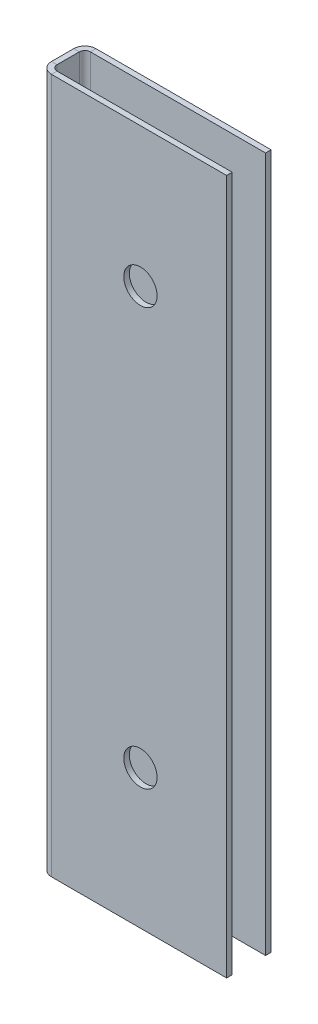
ISO-10303-21;
HEADER;
FILE_DESCRIPTION(('STEP AP214'),'2;1');
FILE_NAME('part.step','',(''),(''),'','','');
FILE_SCHEMA(('AUTOMOTIVE_DESIGN { 1 0 10303 214 1 1 1 1 }'));
ENDSEC;
DATA;
#1=APPLICATION_CONTEXT('core data for automotive mechanical design processes');
#2=APPLICATION_PROTOCOL_DEFINITION('international standard','automotive_design',2000,#1);
#3=PRODUCT_CONTEXT('',#1,'mechanical');
#4=PRODUCT('Part','Part','',(#3));
#5=PRODUCT_RELATED_PRODUCT_CATEGORY('part','',(#4));
#6=PRODUCT_DEFINITION_FORMATION('','',#4);
#7=PRODUCT_DEFINITION_CONTEXT('part definition',#1,'design');
#8=PRODUCT_DEFINITION('design','',#6,#7);
#9=PRODUCT_DEFINITION_SHAPE('','',#8);
#10=(LENGTH_UNIT() NAMED_UNIT(*) SI_UNIT(.MILLI.,.METRE.));
#11=(NAMED_UNIT(*) PLANE_ANGLE_UNIT() SI_UNIT($,.RADIAN.));
#12=(NAMED_UNIT(*) SI_UNIT($,.STERADIAN.) SOLID_ANGLE_UNIT());
#13=UNCERTAINTY_MEASURE_WITH_UNIT(LENGTH_MEASURE(1.E-05),#10,'distance_accuracy_value','');
#14=(GEOMETRIC_REPRESENTATION_CONTEXT(3) GLOBAL_UNCERTAINTY_ASSIGNED_CONTEXT((#13)) GLOBAL_UNIT_ASSIGNED_CONTEXT((#10,
#11,#12)) REPRESENTATION_CONTEXT('',''));
#15=CARTESIAN_POINT('',(0.,0.,0.));
#16=DIRECTION('',(0.,0.,1.));
#17=DIRECTION('',(1.,0.,0.));
#18=AXIS2_PLACEMENT_3D('',#15,#16,#17);
#19=CARTESIAN_POINT('',(-1832.,-495.,-7.99999999999956));
#20=DIRECTION('',(0.,1.,0.));
#21=DIRECTION('',(0.,0.,1.));
#22=AXIS2_PLACEMENT_3D('',#19,#20,#21);
#23=PLANE('',#22);
#24=DIRECTION('',(0.,0.,1.));
#25=VECTOR('',#24,1.);
#26=CARTESIAN_POINT('',(-1834.,-495.,-5.99999999999956));
#27=LINE('',#26,#25);
#28=CARTESIAN_POINT('',(-1834.,-495.,-3.99999999999956));
#29=VERTEX_POINT('',#28);
#30=CARTESIAN_POINT('',(-1834.,-495.,4.00000000000016));
#31=VERTEX_POINT('',#30);
#32=EDGE_CURVE('E205',#29,#31,#27,.T.);
#33=ORIENTED_EDGE('',*,*,#32,.F.);
#34=DIRECTION('',(-1.,0.,0.));
#35=VECTOR('',#34,1.);
#36=CARTESIAN_POINT('',(-1834.,-495.,-3.99999999999956));
#37=LINE('',#36,#35);
#38=CARTESIAN_POINT('',(-1836.,-495.,-3.99999999999956));
#39=VERTEX_POINT('',#38);
#40=EDGE_CURVE('E11',#29,#39,#37,.T.);
#41=ORIENTED_EDGE('',*,*,#40,.T.);
#42=DIRECTION('',(0.,0.,-1.));
#43=VECTOR('',#42,1.);
#44=CARTESIAN_POINT('',(-1836.,-495.,-5.99999999999956));
#45=LINE('',#44,#43);
#46=CARTESIAN_POINT('',(-1836.,-495.,4.00000000000023));
#47=VERTEX_POINT('',#46);
#48=EDGE_CURVE('E248',#39,#47,#45,.F.);
#49=ORIENTED_EDGE('',*,*,#48,.T.);
#50=DIRECTION('',(1.,0.,0.));
#51=VECTOR('',#50,1.);
#52=CARTESIAN_POINT('',(-1836.,-495.,4.00000000000023));
#53=LINE('',#52,#51);
#54=EDGE_CURVE('E256',#47,#31,#53,.T.);
#55=ORIENTED_EDGE('',*,*,#54,.T.);
#56=EDGE_LOOP('',(#33,#41,#49,#55));
#57=FACE_BOUND('',#56,.T.);
#58=ADVANCED_FACE('F36',(#57),#23,.T.);
#59=CARTESIAN_POINT('',(-1832.,-745.,8.00000000000023));
#60=DIRECTION('',(0.,-1.,0.));
#61=DIRECTION('',(0.,0.,-1.));
#62=AXIS2_PLACEMENT_3D('',#59,#60,#61);
#63=PLANE('',#62);
#64=DIRECTION('',(0.,0.,1.));
#65=VECTOR('',#64,1.);
#66=CARTESIAN_POINT('',(-1834.,-745.,-5.99999999999956));
#67=LINE('',#66,#65);
#68=CARTESIAN_POINT('',(-1834.,-745.,-3.99999999999956));
#69=VERTEX_POINT('',#68);
#70=CARTESIAN_POINT('',(-1834.,-745.,4.00000000000023));
#71=VERTEX_POINT('',#70);
#72=EDGE_CURVE('E246',#69,#71,#67,.T.);
#73=ORIENTED_EDGE('',*,*,#72,.T.);
#74=DIRECTION('',(-1.,0.,0.));
#75=VECTOR('',#74,1.);
#76=CARTESIAN_POINT('',(-1834.,-745.,4.00000000000023));
#77=LINE('',#76,#75);
#78=CARTESIAN_POINT('',(-1836.,-745.,4.00000000000023));
#79=VERTEX_POINT('',#78);
#80=EDGE_CURVE('E260',#71,#79,#77,.T.);
#81=ORIENTED_EDGE('',*,*,#80,.T.);
#82=DIRECTION('',(0.,0.,-1.));
#83=VECTOR('',#82,1.);
#84=CARTESIAN_POINT('',(-1836.,-745.,-5.99999999999956));
#85=LINE('',#84,#83);
#86=CARTESIAN_POINT('',(-1836.,-745.,-3.99999999999956));
#87=VERTEX_POINT('',#86);
#88=EDGE_CURVE('E56',#87,#79,#85,.F.);
#89=ORIENTED_EDGE('',*,*,#88,.F.);
#90=DIRECTION('',(1.,0.,0.));
#91=VECTOR('',#90,1.);
#92=CARTESIAN_POINT('',(-1836.,-745.,-3.99999999999956));
#93=LINE('',#92,#91);
#94=EDGE_CURVE('E265',#87,#69,#93,.T.);
#95=ORIENTED_EDGE('',*,*,#94,.T.);
#96=EDGE_LOOP('',(#73,#81,#89,#95));
#97=FACE_BOUND('',#96,.T.);
#98=ADVANCED_FACE('F268',(#97),#63,.T.);
#99=CARTESIAN_POINT('',(-1836.,-745.,-5.99999999999956));
#100=DIRECTION('',(-1.,0.,0.));
#101=DIRECTION('',(0.,0.,1.));
#102=AXIS2_PLACEMENT_3D('',#99,#100,#101);
#103=PLANE('',#102);
#104=ORIENTED_EDGE('',*,*,#48,.F.);
#105=DIRECTION('',(0.,1.,0.));
#106=VECTOR('',#105,1.);
#107=CARTESIAN_POINT('',(-1836.,-745.,-3.99999999999956));
#108=LINE('',#107,#106);
#109=EDGE_CURVE('E43',#87,#39,#108,.T.);
#110=ORIENTED_EDGE('',*,*,#109,.F.);
#111=ORIENTED_EDGE('',*,*,#88,.T.);
#112=DIRECTION('',(0.,1.,0.));
#113=VECTOR('',#112,1.);
#114=CARTESIAN_POINT('',(-1836.,-745.,4.00000000000023));
#115=LINE('',#114,#113);
#116=EDGE_CURVE('E258',#79,#47,#115,.T.);
#117=ORIENTED_EDGE('',*,*,#116,.T.);
#118=EDGE_LOOP('',(#104,#110,#111,#117));
#119=FACE_BOUND('',#118,.T.);
#120=ADVANCED_FACE('F314',(#119),#103,.T.);
#121=CARTESIAN_POINT('',(-1834.,-745.,-5.99999999999956));
#122=DIRECTION('',(-1.,0.,0.));
#123=DIRECTION('',(0.,0.,1.));
#124=AXIS2_PLACEMENT_3D('',#121,#122,#123);
#125=PLANE('',#124);
#126=ORIENTED_EDGE('',*,*,#32,.T.);
#127=DIRECTION('',(0.,1.,0.));
#128=VECTOR('',#127,1.);
#129=CARTESIAN_POINT('',(-1834.,-745.,4.00000000000023));
#130=LINE('',#129,#128);
#131=EDGE_CURVE('E250',#71,#31,#130,.T.);
#132=ORIENTED_EDGE('',*,*,#131,.F.);
#133=ORIENTED_EDGE('',*,*,#72,.F.);
#134=DIRECTION('',(0.,1.,0.));
#135=VECTOR('',#134,1.);
#136=CARTESIAN_POINT('',(-1834.,-745.,-3.99999999999956));
#137=LINE('',#136,#135);
#138=EDGE_CURVE('E262',#69,#29,#137,.T.);
#139=ORIENTED_EDGE('',*,*,#138,.T.);
#140=EDGE_LOOP('',(#126,#132,#133,#139));
#141=FACE_BOUND('',#140,.T.);
#142=ADVANCED_FACE('F290',(#141),#125,.F.);
#143=CARTESIAN_POINT('',(-1769.,-745.,6.00000000000022));
#144=DIRECTION('',(-1.,0.,0.));
#145=DIRECTION('',(0.,0.,1.));
#146=AXIS2_PLACEMENT_3D('',#143,#144,#145);
#147=PLANE('',#146);
#148=DIRECTION('',(0.,0.,1.));
#149=VECTOR('',#148,1.);
#150=CARTESIAN_POINT('',(-1769.,-495.,6.00000000000022));
#151=LINE('',#150,#149);
#152=CARTESIAN_POINT('',(-1769.,-495.,6.00000000000022));
#153=VERTEX_POINT('',#152);
#154=CARTESIAN_POINT('',(-1769.,-495.,8.00000000000023));
#155=VERTEX_POINT('',#154);
#156=EDGE_CURVE('E242',#153,#155,#151,.T.);
#157=ORIENTED_EDGE('',*,*,#156,.T.);
#158=DIRECTION('',(0.,1.,0.));
#159=VECTOR('',#158,1.);
#160=CARTESIAN_POINT('',(-1769.,-745.,8.00000000000023));
#161=LINE('',#160,#159);
#162=CARTESIAN_POINT('',(-1769.,-745.,8.00000000000023));
#163=VERTEX_POINT('',#162);
#164=EDGE_CURVE('E211',#163,#155,#161,.T.);
#165=ORIENTED_EDGE('',*,*,#164,.F.);
#166=DIRECTION('',(0.,0.,1.));
#167=VECTOR('',#166,1.);
#168=CARTESIAN_POINT('',(-1769.,-745.,6.00000000000022));
#169=LINE('',#168,#167);
#170=CARTESIAN_POINT('',(-1769.,-745.,6.00000000000022));
#171=VERTEX_POINT('',#170);
#172=EDGE_CURVE('E203',#171,#163,#169,.T.);
#173=ORIENTED_EDGE('',*,*,#172,.F.);
#174=DIRECTION('',(0.,1.,0.));
#175=VECTOR('',#174,1.);
#176=CARTESIAN_POINT('',(-1769.,-745.,6.00000000000022));
#177=LINE('',#176,#175);
#178=EDGE_CURVE('E239',#171,#153,#177,.T.);
#179=ORIENTED_EDGE('',*,*,#178,.T.);
#180=EDGE_LOOP('',(#157,#165,#173,#179));
#181=FACE_BOUND('',#180,.T.);
#182=ADVANCED_FACE('F329',(#181),#147,.F.);
#183=CARTESIAN_POINT('',(-1800.,-545.,-7.99999999999979));
#184=DIRECTION('',(0.,0.,1.));
#185=DIRECTION('',(1.,0.,0.));
#186=AXIS2_PLACEMENT_3D('',#183,#184,#185);
#187=CYLINDRICAL_SURFACE('',#186,6.0000000000001);
#188=CARTESIAN_POINT('',(-1800.,-545.,8.00000000000023));
#189=DIRECTION('',(0.,0.,1.));
#190=DIRECTION('',(1.,0.,0.));
#191=AXIS2_PLACEMENT_3D('',#188,#189,#190);
#192=CIRCLE('',#191,6.0000000000001);
#193=CARTESIAN_POINT('',(-1794.,-545.,8.00000000000023));
#194=VERTEX_POINT('',#193);
#195=EDGE_CURVE('E236',#194,#194,#192,.T.);
#196=ORIENTED_EDGE('',*,*,#195,.T.);
#197=EDGE_LOOP('',(#196));
#198=FACE_BOUND('',#197,.T.);
#199=CARTESIAN_POINT('',(-1800.,-545.,6.00000000000022));
#200=DIRECTION('',(0.,0.,1.));
#201=DIRECTION('',(1.,0.,0.));
#202=AXIS2_PLACEMENT_3D('',#199,#200,#201);
#203=CIRCLE('',#202,6.0000000000001);
#204=CARTESIAN_POINT('',(-1794.,-545.,6.00000000000022));
#205=VERTEX_POINT('',#204);
#206=EDGE_CURVE('E227',#205,#205,#203,.T.);
#207=ORIENTED_EDGE('',*,*,#206,.F.);
#208=EDGE_LOOP('',(#207));
#209=FACE_BOUND('',#208,.T.);
#210=ADVANCED_FACE('F347',(#198,#209),#187,.F.);
#211=CARTESIAN_POINT('',(-1800.,-695.,-7.99999999999979));
#212=DIRECTION('',(0.,0.,1.));
#213=DIRECTION('',(1.,0.,0.));
#214=AXIS2_PLACEMENT_3D('',#211,#212,#213);
#215=CYLINDRICAL_SURFACE('',#214,6.0000000000001);
#216=CARTESIAN_POINT('',(-1800.,-695.,8.00000000000023));
#217=DIRECTION('',(0.,0.,1.));
#218=DIRECTION('',(1.,0.,0.));
#219=AXIS2_PLACEMENT_3D('',#216,#217,#218);
#220=CIRCLE('',#219,6.0000000000001);
#221=CARTESIAN_POINT('',(-1794.,-695.,8.00000000000023));
#222=VERTEX_POINT('',#221);
#223=EDGE_CURVE('E233',#222,#222,#220,.T.);
#224=ORIENTED_EDGE('',*,*,#223,.T.);
#225=EDGE_LOOP('',(#224));
#226=FACE_BOUND('',#225,.T.);
#227=CARTESIAN_POINT('',(-1800.,-695.,6.00000000000022));
#228=DIRECTION('',(0.,0.,1.));
#229=DIRECTION('',(1.,0.,0.));
#230=AXIS2_PLACEMENT_3D('',#227,#228,#229);
#231=CIRCLE('',#230,6.0000000000001);
#232=CARTESIAN_POINT('',(-1794.,-695.,6.00000000000022));
#233=VERTEX_POINT('',#232);
#234=EDGE_CURVE('E230',#233,#233,#231,.T.);
#235=ORIENTED_EDGE('',*,*,#234,.F.);
#236=EDGE_LOOP('',(#235));
#237=FACE_BOUND('',#236,.T.);
#238=ADVANCED_FACE('F343',(#226,#237),#215,.F.);
#239=CARTESIAN_POINT('',(-1834.,-745.,6.00000000000022));
#240=DIRECTION('',(0.,0.,1.));
#241=DIRECTION('',(1.,0.,0.));
#242=AXIS2_PLACEMENT_3D('',#239,#240,#241);
#243=PLANE('',#242);
#244=ORIENTED_EDGE('',*,*,#234,.T.);
#245=EDGE_LOOP('',(#244));
#246=FACE_BOUND('',#245,.T.);
#247=ORIENTED_EDGE('',*,*,#206,.T.);
#248=EDGE_LOOP('',(#247));
#249=FACE_BOUND('',#248,.T.);
#250=DIRECTION('',(1.,0.,0.));
#251=VECTOR('',#250,1.);
#252=CARTESIAN_POINT('',(-1834.,-495.,6.00000000000022));
#253=LINE('',#252,#251);
#254=CARTESIAN_POINT('',(-1832.,-495.,6.00000000000023));
#255=VERTEX_POINT('',#254);
#256=EDGE_CURVE('E225',#255,#153,#253,.T.);
#257=ORIENTED_EDGE('',*,*,#256,.T.);
#258=ORIENTED_EDGE('',*,*,#178,.F.);
#259=DIRECTION('',(1.,0.,0.));
#260=VECTOR('',#259,1.);
#261=CARTESIAN_POINT('',(-1834.,-745.,6.00000000000022));
#262=LINE('',#261,#260);
#263=CARTESIAN_POINT('',(-1832.,-745.,6.00000000000023));
#264=VERTEX_POINT('',#263);
#265=EDGE_CURVE('E206',#264,#171,#262,.T.);
#266=ORIENTED_EDGE('',*,*,#265,.F.);
#267=DIRECTION('',(0.,1.,0.));
#268=VECTOR('',#267,1.);
#269=CARTESIAN_POINT('',(-1832.,-745.,6.00000000000022));
#270=LINE('',#269,#268);
#271=EDGE_CURVE('E222',#264,#255,#270,.T.);
#272=ORIENTED_EDGE('',*,*,#271,.T.);
#273=EDGE_LOOP('',(#257,#258,#266,#272));
#274=FACE_BOUND('',#273,.T.);
#275=ADVANCED_FACE('F304',(#246,#249,#274),#243,.F.);
#276=CARTESIAN_POINT('',(-1836.,-495.,4.00000000000022));
#277=DIRECTION('',(0.,1.,0.));
#278=DIRECTION('',(0.,0.,1.));
#279=AXIS2_PLACEMENT_3D('',#276,#277,#278);
#280=PLANE('',#279);
#281=ORIENTED_EDGE('',*,*,#256,.F.);
#282=DIRECTION('',(0.,0.,1.));
#283=VECTOR('',#282,1.);
#284=CARTESIAN_POINT('',(-1832.,-495.,6.00000000000022));
#285=LINE('',#284,#283);
#286=CARTESIAN_POINT('',(-1832.,-495.,8.00000000000023));
#287=VERTEX_POINT('',#286);
#288=EDGE_CURVE('E219',#255,#287,#285,.T.);
#289=ORIENTED_EDGE('',*,*,#288,.T.);
#290=DIRECTION('',(1.,0.,0.));
#291=VECTOR('',#290,1.);
#292=CARTESIAN_POINT('',(-1834.,-495.,8.00000000000023));
#293=LINE('',#292,#291);
#294=EDGE_CURVE('E216',#287,#155,#293,.T.);
#295=ORIENTED_EDGE('',*,*,#294,.T.);
#296=ORIENTED_EDGE('',*,*,#156,.F.);
#297=EDGE_LOOP('',(#281,#289,#295,#296));
#298=FACE_BOUND('',#297,.T.);
#299=ADVANCED_FACE('F336',(#298),#280,.T.);
#300=CARTESIAN_POINT('',(-1834.,-745.,8.00000000000023));
#301=DIRECTION('',(0.,0.,1.));
#302=DIRECTION('',(1.,0.,0.));
#303=AXIS2_PLACEMENT_3D('',#300,#301,#302);
#304=PLANE('',#303);
#305=ORIENTED_EDGE('',*,*,#223,.F.);
#306=EDGE_LOOP('',(#305));
#307=FACE_BOUND('',#306,.T.);
#308=ORIENTED_EDGE('',*,*,#195,.F.);
#309=EDGE_LOOP('',(#308));
#310=FACE_BOUND('',#309,.T.);
#311=ORIENTED_EDGE('',*,*,#294,.F.);
#312=DIRECTION('',(0.,1.,0.));
#313=VECTOR('',#312,1.);
#314=CARTESIAN_POINT('',(-1832.,-745.,8.00000000000023));
#315=LINE('',#314,#313);
#316=CARTESIAN_POINT('',(-1832.,-745.,8.00000000000023));
#317=VERTEX_POINT('',#316);
#318=EDGE_CURVE('E198',#317,#287,#315,.T.);
#319=ORIENTED_EDGE('',*,*,#318,.F.);
#320=DIRECTION('',(1.,0.,0.));
#321=VECTOR('',#320,1.);
#322=CARTESIAN_POINT('',(-1834.,-745.,8.00000000000023));
#323=LINE('',#322,#321);
#324=EDGE_CURVE('E213',#317,#163,#323,.T.);
#325=ORIENTED_EDGE('',*,*,#324,.T.);
#326=ORIENTED_EDGE('',*,*,#164,.T.);
#327=EDGE_LOOP('',(#311,#319,#325,#326));
#328=FACE_BOUND('',#327,.T.);
#329=ADVANCED_FACE('F333',(#307,#310,#328),#304,.T.);
#330=CARTESIAN_POINT('',(-1832.,-745.,4.00000000000022));
#331=DIRECTION('',(0.,-1.,0.));
#332=DIRECTION('',(-1.,0.,0.));
#333=AXIS2_PLACEMENT_3D('',#330,#331,#332);
#334=PLANE('',#333);
#335=ORIENTED_EDGE('',*,*,#324,.F.);
#336=DIRECTION('',(0.,0.,-1.));
#337=VECTOR('',#336,1.);
#338=CARTESIAN_POINT('',(-1832.,-745.,8.00000000000023));
#339=LINE('',#338,#337);
#340=EDGE_CURVE('E208',#317,#264,#339,.T.);
#341=ORIENTED_EDGE('',*,*,#340,.T.);
#342=ORIENTED_EDGE('',*,*,#265,.T.);
#343=ORIENTED_EDGE('',*,*,#172,.T.);
#344=EDGE_LOOP('',(#335,#341,#342,#343));
#345=FACE_BOUND('',#344,.T.);
#346=ADVANCED_FACE('F308',(#345),#334,.T.);
#347=CARTESIAN_POINT('',(-1832.,-745.,4.00000000000022));
#348=DIRECTION('',(0.,1.,0.));
#349=DIRECTION('',(0.,0.,1.));
#350=AXIS2_PLACEMENT_3D('',#347,#348,#349);
#351=PLANE('',#350);
#352=ORIENTED_EDGE('',*,*,#340,.F.);
#353=CARTESIAN_POINT('',(-1832.,-745.,4.00000000000022));
#354=DIRECTION('',(0.,1.,0.));
#355=DIRECTION('',(0.,0.,1.));
#356=AXIS2_PLACEMENT_3D('',#353,#354,#355);
#357=CIRCLE('',#356,4.);
#358=EDGE_CURVE('E185',#317,#79,#357,.F.);
#359=ORIENTED_EDGE('',*,*,#358,.T.);
#360=ORIENTED_EDGE('',*,*,#80,.F.);
#361=CARTESIAN_POINT('',(-1832.,-745.,4.00000000000022));
#362=DIRECTION('',(0.,-1.,0.));
#363=DIRECTION('',(0.,0.,-1.));
#364=AXIS2_PLACEMENT_3D('',#361,#362,#363);
#365=CIRCLE('',#364,2.);
#366=EDGE_CURVE('E191',#264,#71,#365,.T.);
#367=ORIENTED_EDGE('',*,*,#366,.F.);
#368=EDGE_LOOP('',(#352,#359,#360,#367));
#369=FACE_BOUND('',#368,.T.);
#370=ADVANCED_FACE('F295',(#369),#351,.F.);
#371=CARTESIAN_POINT('',(-1832.,-495.,4.00000000000022));
#372=DIRECTION('',(0.,-1.,0.));
#373=DIRECTION('',(0.,0.,-1.));
#374=AXIS2_PLACEMENT_3D('',#371,#372,#373);
#375=PLANE('',#374);
#376=ORIENTED_EDGE('',*,*,#54,.F.);
#377=CARTESIAN_POINT('',(-1832.,-495.,4.00000000000022));
#378=DIRECTION('',(0.,1.,0.));
#379=DIRECTION('',(0.,0.,1.));
#380=AXIS2_PLACEMENT_3D('',#377,#378,#379);
#381=CIRCLE('',#380,4.);
#382=EDGE_CURVE('E195',#47,#287,#381,.T.);
#383=ORIENTED_EDGE('',*,*,#382,.T.);
#384=ORIENTED_EDGE('',*,*,#288,.F.);
#385=CARTESIAN_POINT('',(-1832.,-495.,4.00000000000022));
#386=DIRECTION('',(0.,1.,0.));
#387=DIRECTION('',(0.,0.,1.));
#388=AXIS2_PLACEMENT_3D('',#385,#386,#387);
#389=CIRCLE('',#388,2.);
#390=EDGE_CURVE('E194',#31,#255,#389,.T.);
#391=ORIENTED_EDGE('',*,*,#390,.F.);
#392=EDGE_LOOP('',(#376,#383,#384,#391));
#393=FACE_BOUND('',#392,.T.);
#394=ADVANCED_FACE('F316',(#393),#375,.F.);
#395=CARTESIAN_POINT('',(-1832.,-870.039999838911,4.00000000000022));
#396=DIRECTION('',(0.,1.,0.));
#397=DIRECTION('',(0.,0.,1.));
#398=AXIS2_PLACEMENT_3D('',#395,#396,#397);
#399=CYLINDRICAL_SURFACE('',#398,2.);
#400=ORIENTED_EDGE('',*,*,#390,.T.);
#401=ORIENTED_EDGE('',*,*,#271,.F.);
#402=ORIENTED_EDGE('',*,*,#366,.T.);
#403=ORIENTED_EDGE('',*,*,#131,.T.);
#404=EDGE_LOOP('',(#400,#401,#402,#403));
#405=FACE_BOUND('',#404,.T.);
#406=ADVANCED_FACE('F299',(#405),#399,.F.);
#407=CARTESIAN_POINT('',(-1832.,-870.039999838911,4.00000000000022));
#408=DIRECTION('',(0.,1.,0.));
#409=DIRECTION('',(0.,0.,1.));
#410=AXIS2_PLACEMENT_3D('',#407,#408,#409);
#411=CYLINDRICAL_SURFACE('',#410,4.);
#412=ORIENTED_EDGE('',*,*,#382,.F.);
#413=ORIENTED_EDGE('',*,*,#116,.F.);
#414=ORIENTED_EDGE('',*,*,#358,.F.);
#415=ORIENTED_EDGE('',*,*,#318,.T.);
#416=EDGE_LOOP('',(#412,#413,#414,#415));
#417=FACE_BOUND('',#416,.T.);
#418=ADVANCED_FACE('F312',(#417),#411,.T.);
#419=CARTESIAN_POINT('',(-1832.,-745.,-3.99999999999956));
#420=DIRECTION('',(0.,1.,0.));
#421=DIRECTION('',(0.,0.,1.));
#422=AXIS2_PLACEMENT_3D('',#419,#420,#421);
#423=PLANE('',#422);
#424=ORIENTED_EDGE('',*,*,#94,.F.);
#425=CARTESIAN_POINT('',(-1832.,-745.,-3.99999999999956));
#426=DIRECTION('',(0.,1.,0.));
#427=DIRECTION('',(0.,0.,1.));
#428=AXIS2_PLACEMENT_3D('',#425,#426,#427);
#429=CIRCLE('',#428,4.);
#430=CARTESIAN_POINT('',(-1832.,-745.,-7.99999999999956));
#431=VERTEX_POINT('',#430);
#432=EDGE_CURVE('E187',#87,#431,#429,.F.);
#433=ORIENTED_EDGE('',*,*,#432,.T.);
#434=DIRECTION('',(0.,0.,-1.));
#435=VECTOR('',#434,1.);
#436=CARTESIAN_POINT('',(-1832.,-745.,-5.99999999999956));
#437=LINE('',#436,#435);
#438=CARTESIAN_POINT('',(-1832.,-745.,-5.99999999999956));
#439=VERTEX_POINT('',#438);
#440=EDGE_CURVE('E147',#439,#431,#437,.T.);
#441=ORIENTED_EDGE('',*,*,#440,.F.);
#442=CARTESIAN_POINT('',(-1832.,-745.,-3.99999999999956));
#443=DIRECTION('',(0.,-1.,0.));
#444=DIRECTION('',(0.,0.,-1.));
#445=AXIS2_PLACEMENT_3D('',#442,#443,#444);
#446=CIRCLE('',#445,2.);
#447=EDGE_CURVE('E178',#69,#439,#446,.T.);
#448=ORIENTED_EDGE('',*,*,#447,.F.);
#449=EDGE_LOOP('',(#424,#433,#441,#448));
#450=FACE_BOUND('',#449,.T.);
#451=ADVANCED_FACE('F272',(#450),#423,.F.);
#452=CARTESIAN_POINT('',(-1832.,-495.,-3.99999999999956));
#453=DIRECTION('',(0.,-1.,0.));
#454=DIRECTION('',(0.,0.,-1.));
#455=AXIS2_PLACEMENT_3D('',#452,#453,#454);
#456=PLANE('',#455);
#457=DIRECTION('',(0.,0.,1.));
#458=VECTOR('',#457,1.);
#459=CARTESIAN_POINT('',(-1832.,-495.,-7.99999999999956));
#460=LINE('',#459,#458);
#461=CARTESIAN_POINT('',(-1832.,-495.,-7.99999999999956));
#462=VERTEX_POINT('',#461);
#463=CARTESIAN_POINT('',(-1832.,-495.,-5.99999999999956));
#464=VERTEX_POINT('',#463);
#465=EDGE_CURVE('E190',#462,#464,#460,.T.);
#466=ORIENTED_EDGE('',*,*,#465,.F.);
#467=CARTESIAN_POINT('',(-1832.,-495.,-3.99999999999956));
#468=DIRECTION('',(0.,1.,0.));
#469=DIRECTION('',(0.,0.,1.));
#470=AXIS2_PLACEMENT_3D('',#467,#468,#469);
#471=CIRCLE('',#470,4.);
#472=EDGE_CURVE('E182',#462,#39,#471,.T.);
#473=ORIENTED_EDGE('',*,*,#472,.T.);
#474=ORIENTED_EDGE('',*,*,#40,.F.);
#475=CARTESIAN_POINT('',(-1832.,-495.,-3.99999999999956));
#476=DIRECTION('',(0.,1.,0.));
#477=DIRECTION('',(0.,0.,1.));
#478=AXIS2_PLACEMENT_3D('',#475,#476,#477);
#479=CIRCLE('',#478,2.);
#480=EDGE_CURVE('E181',#464,#29,#479,.T.);
#481=ORIENTED_EDGE('',*,*,#480,.F.);
#482=EDGE_LOOP('',(#466,#473,#474,#481));
#483=FACE_BOUND('',#482,.T.);
#484=ADVANCED_FACE('F278',(#483),#456,.F.);
#485=CARTESIAN_POINT('',(-1832.,-870.039999838911,-3.99999999999956));
#486=DIRECTION('',(0.,1.,0.));
#487=DIRECTION('',(0.,0.,1.));
#488=AXIS2_PLACEMENT_3D('',#485,#486,#487);
#489=CYLINDRICAL_SURFACE('',#488,2.);
#490=ORIENTED_EDGE('',*,*,#480,.T.);
#491=ORIENTED_EDGE('',*,*,#138,.F.);
#492=ORIENTED_EDGE('',*,*,#447,.T.);
#493=DIRECTION('',(0.,1.,0.));
#494=VECTOR('',#493,1.);
#495=CARTESIAN_POINT('',(-1832.,-745.,-5.99999999999956));
#496=LINE('',#495,#494);
#497=EDGE_CURVE('E175',#439,#464,#496,.T.);
#498=ORIENTED_EDGE('',*,*,#497,.T.);
#499=EDGE_LOOP('',(#490,#491,#492,#498));
#500=FACE_BOUND('',#499,.T.);
#501=ADVANCED_FACE('F287',(#500),#489,.F.);
#502=CARTESIAN_POINT('',(-1832.,-870.039999838911,-3.99999999999956));
#503=DIRECTION('',(0.,1.,0.));
#504=DIRECTION('',(0.,0.,1.));
#505=AXIS2_PLACEMENT_3D('',#502,#503,#504);
#506=CYLINDRICAL_SURFACE('',#505,4.);
#507=ORIENTED_EDGE('',*,*,#472,.F.);
#508=DIRECTION('',(0.,1.,0.));
#509=VECTOR('',#508,1.);
#510=CARTESIAN_POINT('',(-1832.,-745.,-7.99999999999956));
#511=LINE('',#510,#509);
#512=EDGE_CURVE('E152',#431,#462,#511,.T.);
#513=ORIENTED_EDGE('',*,*,#512,.F.);
#514=ORIENTED_EDGE('',*,*,#432,.F.);
#515=ORIENTED_EDGE('',*,*,#109,.T.);
#516=EDGE_LOOP('',(#507,#513,#514,#515));
#517=FACE_BOUND('',#516,.T.);
#518=ADVANCED_FACE('F274',(#517),#506,.T.);
#519=CARTESIAN_POINT('',(-1769.,-745.,-7.99999999999979));
#520=DIRECTION('',(-1.,0.,0.));
#521=DIRECTION('',(0.,0.,1.));
#522=AXIS2_PLACEMENT_3D('',#519,#520,#521);
#523=PLANE('',#522);
#524=DIRECTION('',(0.,0.,1.));
#525=VECTOR('',#524,1.);
#526=CARTESIAN_POINT('',(-1769.,-495.,-7.99999999999979));
#527=LINE('',#526,#525);
#528=CARTESIAN_POINT('',(-1769.,-495.,-7.99999999999979));
#529=VERTEX_POINT('',#528);
#530=CARTESIAN_POINT('',(-1769.,-495.,-5.99999999999978));
#531=VERTEX_POINT('',#530);
#532=EDGE_CURVE('E136',#529,#531,#527,.T.);
#533=ORIENTED_EDGE('',*,*,#532,.T.);
#534=DIRECTION('',(0.,1.,0.));
#535=VECTOR('',#534,1.);
#536=CARTESIAN_POINT('',(-1769.,-745.,-5.99999999999978));
#537=LINE('',#536,#535);
#538=CARTESIAN_POINT('',(-1769.,-745.,-5.99999999999978));
#539=VERTEX_POINT('',#538);
#540=EDGE_CURVE('E142',#539,#531,#537,.T.);
#541=ORIENTED_EDGE('',*,*,#540,.F.);
#542=DIRECTION('',(0.,0.,1.));
#543=VECTOR('',#542,1.);
#544=CARTESIAN_POINT('',(-1769.,-745.,-7.99999999999979));
#545=LINE('',#544,#543);
#546=CARTESIAN_POINT('',(-1769.,-745.,-7.99999999999979));
#547=VERTEX_POINT('',#546);
#548=EDGE_CURVE('E139',#547,#539,#545,.T.);
#549=ORIENTED_EDGE('',*,*,#548,.F.);
#550=DIRECTION('',(0.,1.,0.));
#551=VECTOR('',#550,1.);
#552=CARTESIAN_POINT('',(-1769.,-745.,-7.99999999999979));
#553=LINE('',#552,#551);
#554=EDGE_CURVE('E125',#547,#529,#553,.T.);
#555=ORIENTED_EDGE('',*,*,#554,.T.);
#556=EDGE_LOOP('',(#533,#541,#549,#555));
#557=FACE_BOUND('',#556,.T.);
#558=ADVANCED_FACE('F140',(#557),#523,.F.);
#559=CARTESIAN_POINT('',(-1800.,-545.,-7.99999999999979));
#560=DIRECTION('',(0.,0.,1.));
#561=DIRECTION('',(1.,0.,0.));
#562=AXIS2_PLACEMENT_3D('',#559,#560,#561);
#563=CYLINDRICAL_SURFACE('',#562,6.0000000000001);
#564=CARTESIAN_POINT('',(-1800.,-545.,-7.99999999999979));
#565=DIRECTION('',(0.,0.,1.));
#566=DIRECTION('',(1.,0.,0.));
#567=AXIS2_PLACEMENT_3D('',#564,#565,#566);
#568=CIRCLE('',#567,6.0000000000001);
#569=CARTESIAN_POINT('',(-1794.,-545.,-7.99999999999979));
#570=VERTEX_POINT('',#569);
#571=EDGE_CURVE('E153',#570,#570,#568,.T.);
#572=ORIENTED_EDGE('',*,*,#571,.F.);
#573=EDGE_LOOP('',(#572));
#574=FACE_BOUND('',#573,.T.);
#575=CARTESIAN_POINT('',(-1800.,-545.,-5.99999999999956));
#576=DIRECTION('',(0.,0.,-1.));
#577=DIRECTION('',(-1.,0.,0.));
#578=AXIS2_PLACEMENT_3D('',#575,#576,#577);
#579=CIRCLE('',#578,6.0000000000001);
#580=CARTESIAN_POINT('',(-1806.,-545.,-5.99999999999956));
#581=VERTEX_POINT('',#580);
#582=EDGE_CURVE('E169',#581,#581,#579,.T.);
#583=ORIENTED_EDGE('',*,*,#582,.F.);
#584=EDGE_LOOP('',(#583));
#585=FACE_BOUND('',#584,.T.);
#586=ADVANCED_FACE('F384',(#574,#585),#563,.F.);
#587=CARTESIAN_POINT('',(-1800.,-695.,-7.99999999999979));
#588=DIRECTION('',(0.,0.,1.));
#589=DIRECTION('',(1.,0.,0.));
#590=AXIS2_PLACEMENT_3D('',#587,#588,#589);
#591=CYLINDRICAL_SURFACE('',#590,6.0000000000001);
#592=CARTESIAN_POINT('',(-1800.,-695.,-7.99999999999979));
#593=DIRECTION('',(0.,0.,1.));
#594=DIRECTION('',(1.,0.,0.));
#595=AXIS2_PLACEMENT_3D('',#592,#593,#594);
#596=CIRCLE('',#595,6.0000000000001);
#597=CARTESIAN_POINT('',(-1794.,-695.,-7.99999999999979));
#598=VERTEX_POINT('',#597);
#599=EDGE_CURVE('E146',#598,#598,#596,.T.);
#600=ORIENTED_EDGE('',*,*,#599,.F.);
#601=EDGE_LOOP('',(#600));
#602=FACE_BOUND('',#601,.T.);
#603=CARTESIAN_POINT('',(-1800.,-695.,-5.99999999999956));
#604=DIRECTION('',(0.,0.,-1.));
#605=DIRECTION('',(-1.,0.,0.));
#606=AXIS2_PLACEMENT_3D('',#603,#604,#605);
#607=CIRCLE('',#606,6.0000000000001);
#608=CARTESIAN_POINT('',(-1806.,-695.,-5.99999999999956));
#609=VERTEX_POINT('',#608);
#610=EDGE_CURVE('E135',#609,#609,#607,.T.);
#611=ORIENTED_EDGE('',*,*,#610,.F.);
#612=EDGE_LOOP('',(#611));
#613=FACE_BOUND('',#612,.T.);
#614=ADVANCED_FACE('F380',(#602,#613),#591,.F.);
#615=CARTESIAN_POINT('',(-1769.,-745.,-5.99999999999978));
#616=DIRECTION('',(0.,0.,-1.));
#617=DIRECTION('',(-1.,0.,0.));
#618=AXIS2_PLACEMENT_3D('',#615,#616,#617);
#619=PLANE('',#618);
#620=ORIENTED_EDGE('',*,*,#610,.T.);
#621=EDGE_LOOP('',(#620));
#622=FACE_BOUND('',#621,.T.);
#623=ORIENTED_EDGE('',*,*,#582,.T.);
#624=EDGE_LOOP('',(#623));
#625=FACE_BOUND('',#624,.T.);
#626=DIRECTION('',(-1.,0.,0.));
#627=VECTOR('',#626,1.);
#628=CARTESIAN_POINT('',(-1769.,-495.,-5.99999999999978));
#629=LINE('',#628,#627);
#630=EDGE_CURVE('E166',#531,#464,#629,.T.);
#631=ORIENTED_EDGE('',*,*,#630,.T.);
#632=ORIENTED_EDGE('',*,*,#497,.F.);
#633=DIRECTION('',(-1.,0.,0.));
#634=VECTOR('',#633,1.);
#635=CARTESIAN_POINT('',(-1769.,-745.,-5.99999999999978));
#636=LINE('',#635,#634);
#637=EDGE_CURVE('E163',#539,#439,#636,.T.);
#638=ORIENTED_EDGE('',*,*,#637,.F.);
#639=ORIENTED_EDGE('',*,*,#540,.T.);
#640=EDGE_LOOP('',(#631,#632,#638,#639));
#641=FACE_BOUND('',#640,.T.);
#642=ADVANCED_FACE('F285',(#622,#625,#641),#619,.F.);
#643=CARTESIAN_POINT('',(-1836.,-745.,-3.99999999999956));
#644=DIRECTION('',(0.,-1.,0.));
#645=DIRECTION('',(0.,0.,-1.));
#646=AXIS2_PLACEMENT_3D('',#643,#644,#645);
#647=PLANE('',#646);
#648=ORIENTED_EDGE('',*,*,#637,.T.);
#649=ORIENTED_EDGE('',*,*,#440,.T.);
#650=DIRECTION('',(-1.,0.,0.));
#651=VECTOR('',#650,1.);
#652=CARTESIAN_POINT('',(-1769.,-745.,-7.99999999999979));
#653=LINE('',#652,#651);
#654=EDGE_CURVE('E130',#547,#431,#653,.T.);
#655=ORIENTED_EDGE('',*,*,#654,.F.);
#656=ORIENTED_EDGE('',*,*,#548,.T.);
#657=EDGE_LOOP('',(#648,#649,#655,#656));
#658=FACE_BOUND('',#657,.T.);
#659=ADVANCED_FACE('F149',(#658),#647,.T.);
#660=CARTESIAN_POINT('',(-1769.,-745.,-7.99999999999979));
#661=DIRECTION('',(0.,0.,-1.));
#662=DIRECTION('',(-1.,0.,0.));
#663=AXIS2_PLACEMENT_3D('',#660,#661,#662);
#664=PLANE('',#663);
#665=ORIENTED_EDGE('',*,*,#599,.T.);
#666=EDGE_LOOP('',(#665));
#667=FACE_BOUND('',#666,.T.);
#668=ORIENTED_EDGE('',*,*,#571,.T.);
#669=EDGE_LOOP('',(#668));
#670=FACE_BOUND('',#669,.T.);
#671=DIRECTION('',(-1.,0.,0.));
#672=VECTOR('',#671,1.);
#673=CARTESIAN_POINT('',(-1769.,-495.,-7.99999999999979));
#674=LINE('',#673,#672);
#675=EDGE_CURVE('E132',#529,#462,#674,.T.);
#676=ORIENTED_EDGE('',*,*,#675,.F.);
#677=ORIENTED_EDGE('',*,*,#554,.F.);
#678=ORIENTED_EDGE('',*,*,#654,.T.);
#679=ORIENTED_EDGE('',*,*,#512,.T.);
#680=EDGE_LOOP('',(#676,#677,#678,#679));
#681=FACE_BOUND('',#680,.T.);
#682=ADVANCED_FACE('F127',(#667,#670,#681),#664,.T.);
#683=CARTESIAN_POINT('',(-1832.,-495.,4.00000000000023));
#684=DIRECTION('',(0.,-1.,0.));
#685=DIRECTION('',(-1.,0.,0.));
#686=AXIS2_PLACEMENT_3D('',#683,#684,#685);
#687=PLANE('',#686);
#688=ORIENTED_EDGE('',*,*,#675,.T.);
#689=ORIENTED_EDGE('',*,*,#465,.T.);
#690=ORIENTED_EDGE('',*,*,#630,.F.);
#691=ORIENTED_EDGE('',*,*,#532,.F.);
#692=EDGE_LOOP('',(#688,#689,#690,#691));
#693=FACE_BOUND('',#692,.T.);
#694=ADVANCED_FACE('F283',(#693),#687,.F.);
#695=CLOSED_SHELL('',(#58,#98,#120,#142,#182,#210,#238,#275,#299,#329,#346,#370,#394,#406,#418,
#451,#484,#501,#518,#558,#586,#614,#642,#659,#682,#694));
#696=MANIFOLD_SOLID_BREP('B2',#695);
#697=ADVANCED_BREP_SHAPE_REPRESENTATION('',(#18,#696),#14);
#698=SHAPE_DEFINITION_REPRESENTATION(#9,#697);
ENDSEC;
END-ISO-10303-21;
